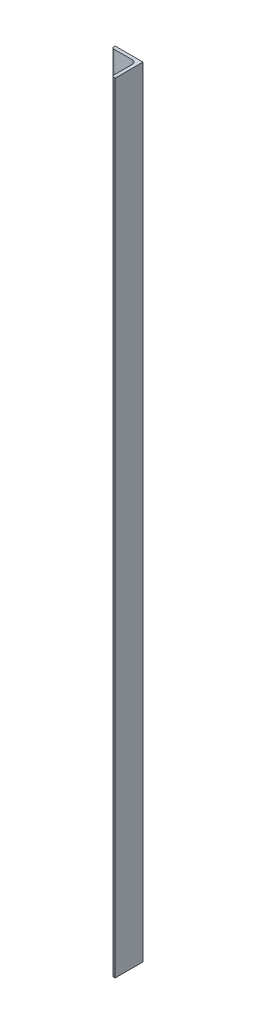
ISO-10303-21;
HEADER;
FILE_DESCRIPTION(('STEP AP214'),'2;1');
FILE_NAME('part.step','',(''),(''),'','','');
FILE_SCHEMA(('AUTOMOTIVE_DESIGN { 1 0 10303 214 1 1 1 1 }'));
ENDSEC;
DATA;
#1=APPLICATION_CONTEXT('core data for automotive mechanical design processes');
#2=APPLICATION_PROTOCOL_DEFINITION('international standard','automotive_design',2000,#1);
#3=PRODUCT_CONTEXT('',#1,'mechanical');
#4=PRODUCT('Part','Part','',(#3));
#5=PRODUCT_RELATED_PRODUCT_CATEGORY('part','',(#4));
#6=PRODUCT_DEFINITION_FORMATION('','',#4);
#7=PRODUCT_DEFINITION_CONTEXT('part definition',#1,'design');
#8=PRODUCT_DEFINITION('design','',#6,#7);
#9=PRODUCT_DEFINITION_SHAPE('','',#8);
#10=(LENGTH_UNIT() NAMED_UNIT(*) SI_UNIT(.MILLI.,.METRE.));
#11=(NAMED_UNIT(*) PLANE_ANGLE_UNIT() SI_UNIT($,.RADIAN.));
#12=(NAMED_UNIT(*) SI_UNIT($,.STERADIAN.) SOLID_ANGLE_UNIT());
#13=UNCERTAINTY_MEASURE_WITH_UNIT(LENGTH_MEASURE(1.E-05),#10,'distance_accuracy_value','');
#14=(GEOMETRIC_REPRESENTATION_CONTEXT(3) GLOBAL_UNCERTAINTY_ASSIGNED_CONTEXT((#13)) GLOBAL_UNIT_ASSIGNED_CONTEXT((#10,
#11,#12)) REPRESENTATION_CONTEXT('',''));
#15=CARTESIAN_POINT('',(0.,0.,0.));
#16=DIRECTION('',(0.,0.,1.));
#17=DIRECTION('',(1.,0.,0.));
#18=AXIS2_PLACEMENT_3D('',#15,#16,#17);
#19=CARTESIAN_POINT('',(0.,700.,0.));
#20=DIRECTION('',(-1.,0.,0.));
#21=DIRECTION('',(0.,0.,1.));
#22=AXIS2_PLACEMENT_3D('',#19,#20,#21);
#23=PLANE('',#22);
#24=DIRECTION('',(0.,0.,-1.));
#25=VECTOR('',#24,1.);
#26=CARTESIAN_POINT('',(0.,-700.,0.));
#27=LINE('',#26,#25);
#28=CARTESIAN_POINT('',(0.,-700.,50.));
#29=VERTEX_POINT('',#28);
#30=CARTESIAN_POINT('',(0.,-700.,0.));
#31=VERTEX_POINT('',#30);
#32=EDGE_CURVE('E135',#29,#31,#27,.T.);
#33=ORIENTED_EDGE('',*,*,#32,.T.);
#34=DIRECTION('',(0.,-1.,0.));
#35=VECTOR('',#34,1.);
#36=CARTESIAN_POINT('',(0.,700.,0.));
#37=LINE('',#36,#35);
#38=CARTESIAN_POINT('',(0.,700.,0.));
#39=VERTEX_POINT('',#38);
#40=EDGE_CURVE('E11',#39,#31,#37,.T.);
#41=ORIENTED_EDGE('',*,*,#40,.F.);
#42=DIRECTION('',(0.,0.,-1.));
#43=VECTOR('',#42,1.);
#44=CARTESIAN_POINT('',(0.,700.,0.));
#45=LINE('',#44,#43);
#46=CARTESIAN_POINT('',(0.,700.,50.));
#47=VERTEX_POINT('',#46);
#48=EDGE_CURVE('E152',#47,#39,#45,.T.);
#49=ORIENTED_EDGE('',*,*,#48,.F.);
#50=DIRECTION('',(0.,-1.,0.));
#51=VECTOR('',#50,1.);
#52=CARTESIAN_POINT('',(0.,700.,50.));
#53=LINE('',#52,#51);
#54=EDGE_CURVE('E131',#47,#29,#53,.T.);
#55=ORIENTED_EDGE('',*,*,#54,.T.);
#56=EDGE_LOOP('',(#33,#41,#49,#55));
#57=FACE_BOUND('',#56,.T.);
#58=ADVANCED_FACE('F33',(#57),#23,.F.);
#59=CARTESIAN_POINT('',(0.,700.,0.));
#60=DIRECTION('',(0.,0.,1.));
#61=DIRECTION('',(1.,0.,0.));
#62=AXIS2_PLACEMENT_3D('',#59,#60,#61);
#63=PLANE('',#62);
#64=CARTESIAN_POINT('',(-30.,52.92,0.));
#65=DIRECTION('',(0.,0.,-1.));
#66=DIRECTION('',(-1.,0.,0.));
#67=AXIS2_PLACEMENT_3D('',#64,#65,#66);
#68=CIRCLE('',#67,6.00000000000001);
#69=CARTESIAN_POINT('',(-36.,52.92,0.));
#70=VERTEX_POINT('',#69);
#71=EDGE_CURVE('E196',#70,#70,#68,.T.);
#72=ORIENTED_EDGE('',*,*,#71,.F.);
#73=EDGE_LOOP('',(#72));
#74=FACE_BOUND('',#73,.T.);
#75=CARTESIAN_POINT('',(-30.,-52.92,0.));
#76=DIRECTION('',(0.,0.,-1.));
#77=DIRECTION('',(1.,0.,0.));
#78=AXIS2_PLACEMENT_3D('',#75,#76,#77);
#79=CIRCLE('',#78,6.00000000000001);
#80=CARTESIAN_POINT('',(-24.,-52.92,0.));
#81=VERTEX_POINT('',#80);
#82=EDGE_CURVE('E197',#81,#81,#79,.T.);
#83=ORIENTED_EDGE('',*,*,#82,.F.);
#84=EDGE_LOOP('',(#83));
#85=FACE_BOUND('',#84,.T.);
#86=DIRECTION('',(-1.,0.,0.));
#87=VECTOR('',#86,1.);
#88=CARTESIAN_POINT('',(0.,-700.,0.));
#89=LINE('',#88,#87);
#90=CARTESIAN_POINT('',(-50.,-700.,0.));
#91=VERTEX_POINT('',#90);
#92=EDGE_CURVE('E138',#31,#91,#89,.T.);
#93=ORIENTED_EDGE('',*,*,#92,.T.);
#94=DIRECTION('',(0.,-1.,0.));
#95=VECTOR('',#94,1.);
#96=CARTESIAN_POINT('',(-50.,700.,0.));
#97=LINE('',#96,#95);
#98=CARTESIAN_POINT('',(-50.,700.,0.));
#99=VERTEX_POINT('',#98);
#100=EDGE_CURVE('E41',#99,#91,#97,.T.);
#101=ORIENTED_EDGE('',*,*,#100,.F.);
#102=DIRECTION('',(-1.,0.,0.));
#103=VECTOR('',#102,1.);
#104=CARTESIAN_POINT('',(0.,700.,0.));
#105=LINE('',#104,#103);
#106=EDGE_CURVE('E95',#39,#99,#105,.T.);
#107=ORIENTED_EDGE('',*,*,#106,.F.);
#108=ORIENTED_EDGE('',*,*,#40,.T.);
#109=EDGE_LOOP('',(#93,#101,#107,#108));
#110=FACE_BOUND('',#109,.T.);
#111=ADVANCED_FACE('F208',(#74,#85,#110),#63,.F.);
#112=CARTESIAN_POINT('',(-50.,700.,0.));
#113=DIRECTION('',(1.,0.,0.));
#114=DIRECTION('',(0.,0.,-1.));
#115=AXIS2_PLACEMENT_3D('',#112,#113,#114);
#116=PLANE('',#115);
#117=DIRECTION('',(0.,0.,1.));
#118=VECTOR('',#117,1.);
#119=CARTESIAN_POINT('',(-50.,-700.,0.));
#120=LINE('',#119,#118);
#121=CARTESIAN_POINT('',(-50.,-700.,2.50000000000001));
#122=VERTEX_POINT('',#121);
#123=EDGE_CURVE('E141',#91,#122,#120,.T.);
#124=ORIENTED_EDGE('',*,*,#123,.T.);
#125=DIRECTION('',(0.,-1.,0.));
#126=VECTOR('',#125,1.);
#127=CARTESIAN_POINT('',(-50.,700.,2.50000000000001));
#128=LINE('',#127,#126);
#129=CARTESIAN_POINT('',(-50.,700.,2.50000000000001));
#130=VERTEX_POINT('',#129);
#131=EDGE_CURVE('E162',#130,#122,#128,.T.);
#132=ORIENTED_EDGE('',*,*,#131,.F.);
#133=DIRECTION('',(0.,0.,1.));
#134=VECTOR('',#133,1.);
#135=CARTESIAN_POINT('',(-50.,700.,0.));
#136=LINE('',#135,#134);
#137=EDGE_CURVE('E170',#99,#130,#136,.T.);
#138=ORIENTED_EDGE('',*,*,#137,.F.);
#139=ORIENTED_EDGE('',*,*,#100,.T.);
#140=EDGE_LOOP('',(#124,#132,#138,#139));
#141=FACE_BOUND('',#140,.T.);
#142=ADVANCED_FACE('F168',(#141),#116,.F.);
#143=CARTESIAN_POINT('',(-46.5,700.,2.50000000000001));
#144=DIRECTION('',(0.,-1.,0.));
#145=DIRECTION('',(0.,0.,-1.));
#146=AXIS2_PLACEMENT_3D('',#143,#144,#145);
#147=CYLINDRICAL_SURFACE('',#146,3.5);
#148=CARTESIAN_POINT('',(-46.5,-700.,2.50000000000001));
#149=DIRECTION('',(0.,1.,0.));
#150=DIRECTION('',(0.,0.,1.));
#151=AXIS2_PLACEMENT_3D('',#148,#149,#150);
#152=CIRCLE('',#151,3.5);
#153=CARTESIAN_POINT('',(-46.5,-700.,6.00000000000001));
#154=VERTEX_POINT('',#153);
#155=EDGE_CURVE('E143',#122,#154,#152,.T.);
#156=ORIENTED_EDGE('',*,*,#155,.T.);
#157=DIRECTION('',(0.,-1.,0.));
#158=VECTOR('',#157,1.);
#159=CARTESIAN_POINT('',(-46.5,700.,6.00000000000001));
#160=LINE('',#159,#158);
#161=CARTESIAN_POINT('',(-46.5,700.,6.00000000000001));
#162=VERTEX_POINT('',#161);
#163=EDGE_CURVE('E159',#162,#154,#160,.T.);
#164=ORIENTED_EDGE('',*,*,#163,.F.);
#165=CARTESIAN_POINT('',(-46.5,700.,2.50000000000001));
#166=DIRECTION('',(0.,1.,0.));
#167=DIRECTION('',(0.,0.,1.));
#168=AXIS2_PLACEMENT_3D('',#165,#166,#167);
#169=CIRCLE('',#168,3.5);
#170=EDGE_CURVE('E186',#130,#162,#169,.T.);
#171=ORIENTED_EDGE('',*,*,#170,.F.);
#172=ORIENTED_EDGE('',*,*,#131,.T.);
#173=EDGE_LOOP('',(#156,#164,#171,#172));
#174=FACE_BOUND('',#173,.T.);
#175=ADVANCED_FACE('F179',(#174),#147,.T.);
#176=CARTESIAN_POINT('',(-46.5,700.,6.00000000000001));
#177=DIRECTION('',(0.,0.,-1.));
#178=DIRECTION('',(-1.,0.,0.));
#179=AXIS2_PLACEMENT_3D('',#176,#177,#178);
#180=PLANE('',#179);
#181=CARTESIAN_POINT('',(-30.,52.92,6.00000000000001));
#182=DIRECTION('',(0.,0.,-1.));
#183=DIRECTION('',(-1.,0.,0.));
#184=AXIS2_PLACEMENT_3D('',#181,#182,#183);
#185=CIRCLE('',#184,6.00000000000001);
#186=CARTESIAN_POINT('',(-36.,52.92,6.00000000000001));
#187=VERTEX_POINT('',#186);
#188=EDGE_CURVE('E139',#187,#187,#185,.F.);
#189=ORIENTED_EDGE('',*,*,#188,.F.);
#190=EDGE_LOOP('',(#189));
#191=FACE_BOUND('',#190,.T.);
#192=CARTESIAN_POINT('',(-30.,-52.92,6.00000000000001));
#193=DIRECTION('',(0.,0.,-1.));
#194=DIRECTION('',(-1.,0.,0.));
#195=AXIS2_PLACEMENT_3D('',#192,#193,#194);
#196=CIRCLE('',#195,6.00000000000001);
#197=CARTESIAN_POINT('',(-36.,-52.92,6.00000000000001));
#198=VERTEX_POINT('',#197);
#199=EDGE_CURVE('E193',#198,#198,#196,.F.);
#200=ORIENTED_EDGE('',*,*,#199,.F.);
#201=EDGE_LOOP('',(#200));
#202=FACE_BOUND('',#201,.T.);
#203=DIRECTION('',(1.,0.,0.));
#204=VECTOR('',#203,1.);
#205=CARTESIAN_POINT('',(-46.5,-700.,6.00000000000001));
#206=LINE('',#205,#204);
#207=CARTESIAN_POINT('',(-13.,-700.,6.00000000000001));
#208=VERTEX_POINT('',#207);
#209=EDGE_CURVE('E145',#154,#208,#206,.T.);
#210=ORIENTED_EDGE('',*,*,#209,.T.);
#211=DIRECTION('',(0.,-1.,0.));
#212=VECTOR('',#211,1.);
#213=CARTESIAN_POINT('',(-13.,700.,6.00000000000001));
#214=LINE('',#213,#212);
#215=CARTESIAN_POINT('',(-13.,700.,6.00000000000001));
#216=VERTEX_POINT('',#215);
#217=EDGE_CURVE('E156',#216,#208,#214,.T.);
#218=ORIENTED_EDGE('',*,*,#217,.F.);
#219=DIRECTION('',(1.,0.,0.));
#220=VECTOR('',#219,1.);
#221=CARTESIAN_POINT('',(-46.5,700.,6.00000000000001));
#222=LINE('',#221,#220);
#223=EDGE_CURVE('E185',#162,#216,#222,.T.);
#224=ORIENTED_EDGE('',*,*,#223,.F.);
#225=ORIENTED_EDGE('',*,*,#163,.T.);
#226=EDGE_LOOP('',(#210,#218,#224,#225));
#227=FACE_BOUND('',#226,.T.);
#228=ADVANCED_FACE('F183',(#191,#202,#227),#180,.F.);
#229=CARTESIAN_POINT('',(-13.,700.,13.));
#230=DIRECTION('',(0.,-1.,0.));
#231=DIRECTION('',(0.,0.,-1.));
#232=AXIS2_PLACEMENT_3D('',#229,#230,#231);
#233=CYLINDRICAL_SURFACE('',#232,7.);
#234=CARTESIAN_POINT('',(-13.,-700.,13.));
#235=DIRECTION('',(0.,-1.,0.));
#236=DIRECTION('',(0.,0.,-1.));
#237=AXIS2_PLACEMENT_3D('',#234,#235,#236);
#238=CIRCLE('',#237,7.);
#239=CARTESIAN_POINT('',(-6.,-700.,13.));
#240=VERTEX_POINT('',#239);
#241=EDGE_CURVE('E147',#208,#240,#238,.T.);
#242=ORIENTED_EDGE('',*,*,#241,.T.);
#243=DIRECTION('',(0.,-1.,0.));
#244=VECTOR('',#243,1.);
#245=CARTESIAN_POINT('',(-6.,700.,13.));
#246=LINE('',#245,#244);
#247=CARTESIAN_POINT('',(-6.,700.,13.));
#248=VERTEX_POINT('',#247);
#249=EDGE_CURVE('E126',#248,#240,#246,.T.);
#250=ORIENTED_EDGE('',*,*,#249,.F.);
#251=CARTESIAN_POINT('',(-13.,700.,13.));
#252=DIRECTION('',(0.,-1.,0.));
#253=DIRECTION('',(0.,0.,-1.));
#254=AXIS2_PLACEMENT_3D('',#251,#252,#253);
#255=CIRCLE('',#254,7.);
#256=EDGE_CURVE('E117',#216,#248,#255,.T.);
#257=ORIENTED_EDGE('',*,*,#256,.F.);
#258=ORIENTED_EDGE('',*,*,#217,.T.);
#259=EDGE_LOOP('',(#242,#250,#257,#258));
#260=FACE_BOUND('',#259,.T.);
#261=ADVANCED_FACE('F216',(#260),#233,.F.);
#262=CARTESIAN_POINT('',(-6.,700.,46.5));
#263=DIRECTION('',(1.,0.,0.));
#264=DIRECTION('',(0.,0.,-1.));
#265=AXIS2_PLACEMENT_3D('',#262,#263,#264);
#266=PLANE('',#265);
#267=DIRECTION('',(0.,0.,1.));
#268=VECTOR('',#267,1.);
#269=CARTESIAN_POINT('',(-6.,-700.,46.5));
#270=LINE('',#269,#268);
#271=CARTESIAN_POINT('',(-6.,-700.,46.5));
#272=VERTEX_POINT('',#271);
#273=EDGE_CURVE('E125',#240,#272,#270,.T.);
#274=ORIENTED_EDGE('',*,*,#273,.T.);
#275=DIRECTION('',(0.,-1.,0.));
#276=VECTOR('',#275,1.);
#277=CARTESIAN_POINT('',(-6.,700.,46.5));
#278=LINE('',#277,#276);
#279=CARTESIAN_POINT('',(-6.,700.,46.5));
#280=VERTEX_POINT('',#279);
#281=EDGE_CURVE('E122',#280,#272,#278,.T.);
#282=ORIENTED_EDGE('',*,*,#281,.F.);
#283=DIRECTION('',(0.,0.,1.));
#284=VECTOR('',#283,1.);
#285=CARTESIAN_POINT('',(-6.,700.,46.5));
#286=LINE('',#285,#284);
#287=EDGE_CURVE('E111',#248,#280,#286,.T.);
#288=ORIENTED_EDGE('',*,*,#287,.F.);
#289=ORIENTED_EDGE('',*,*,#249,.T.);
#290=EDGE_LOOP('',(#274,#282,#288,#289));
#291=FACE_BOUND('',#290,.T.);
#292=ADVANCED_FACE('F123',(#291),#266,.F.);
#293=CARTESIAN_POINT('',(-2.49999999999999,700.,46.5));
#294=DIRECTION('',(0.,-1.,0.));
#295=DIRECTION('',(0.,0.,-1.));
#296=AXIS2_PLACEMENT_3D('',#293,#294,#295);
#297=CYLINDRICAL_SURFACE('',#296,3.5);
#298=CARTESIAN_POINT('',(-2.49999999999999,-700.,46.5));
#299=DIRECTION('',(0.,1.,0.));
#300=DIRECTION('',(0.,0.,-1.));
#301=AXIS2_PLACEMENT_3D('',#298,#299,#300);
#302=CIRCLE('',#301,3.5);
#303=CARTESIAN_POINT('',(-2.49999999999999,-700.,50.));
#304=VERTEX_POINT('',#303);
#305=EDGE_CURVE('E81',#272,#304,#302,.T.);
#306=ORIENTED_EDGE('',*,*,#305,.T.);
#307=DIRECTION('',(0.,-1.,0.));
#308=VECTOR('',#307,1.);
#309=CARTESIAN_POINT('',(-2.49999999999999,700.,50.));
#310=LINE('',#309,#308);
#311=CARTESIAN_POINT('',(-2.49999999999999,700.,50.));
#312=VERTEX_POINT('',#311);
#313=EDGE_CURVE('E127',#312,#304,#310,.T.);
#314=ORIENTED_EDGE('',*,*,#313,.F.);
#315=CARTESIAN_POINT('',(-2.49999999999999,700.,46.5));
#316=DIRECTION('',(0.,1.,0.));
#317=DIRECTION('',(0.,0.,-1.));
#318=AXIS2_PLACEMENT_3D('',#315,#316,#317);
#319=CIRCLE('',#318,3.5);
#320=EDGE_CURVE('E115',#280,#312,#319,.T.);
#321=ORIENTED_EDGE('',*,*,#320,.F.);
#322=ORIENTED_EDGE('',*,*,#281,.T.);
#323=EDGE_LOOP('',(#306,#314,#321,#322));
#324=FACE_BOUND('',#323,.T.);
#325=ADVANCED_FACE('F129',(#324),#297,.T.);
#326=CARTESIAN_POINT('',(0.,700.,50.));
#327=DIRECTION('',(0.,0.,-1.));
#328=DIRECTION('',(-1.,0.,0.));
#329=AXIS2_PLACEMENT_3D('',#326,#327,#328);
#330=PLANE('',#329);
#331=DIRECTION('',(1.,0.,0.));
#332=VECTOR('',#331,1.);
#333=CARTESIAN_POINT('',(0.,-700.,50.));
#334=LINE('',#333,#332);
#335=EDGE_CURVE('E87',#304,#29,#334,.T.);
#336=ORIENTED_EDGE('',*,*,#335,.T.);
#337=ORIENTED_EDGE('',*,*,#54,.F.);
#338=DIRECTION('',(1.,0.,0.));
#339=VECTOR('',#338,1.);
#340=CARTESIAN_POINT('',(0.,700.,50.));
#341=LINE('',#340,#339);
#342=EDGE_CURVE('E49',#312,#47,#341,.T.);
#343=ORIENTED_EDGE('',*,*,#342,.F.);
#344=ORIENTED_EDGE('',*,*,#313,.T.);
#345=EDGE_LOOP('',(#336,#337,#343,#344));
#346=FACE_BOUND('',#345,.T.);
#347=ADVANCED_FACE('F278',(#346),#330,.F.);
#348=CARTESIAN_POINT('',(-2.49999999999999,700.,46.5));
#349=DIRECTION('',(0.,-1.,0.));
#350=DIRECTION('',(0.,0.,-1.));
#351=AXIS2_PLACEMENT_3D('',#348,#349,#350);
#352=PLANE('',#351);
#353=ORIENTED_EDGE('',*,*,#48,.T.);
#354=ORIENTED_EDGE('',*,*,#106,.T.);
#355=ORIENTED_EDGE('',*,*,#137,.T.);
#356=ORIENTED_EDGE('',*,*,#170,.T.);
#357=ORIENTED_EDGE('',*,*,#223,.T.);
#358=ORIENTED_EDGE('',*,*,#256,.T.);
#359=ORIENTED_EDGE('',*,*,#287,.T.);
#360=ORIENTED_EDGE('',*,*,#320,.T.);
#361=ORIENTED_EDGE('',*,*,#342,.T.);
#362=EDGE_LOOP('',(#353,#354,#355,#356,#357,#358,#359,#360,#361));
#363=FACE_BOUND('',#362,.T.);
#364=ADVANCED_FACE('F113',(#363),#352,.F.);
#365=CARTESIAN_POINT('',(-2.49999999999999,-700.,46.5));
#366=DIRECTION('',(0.,-1.,0.));
#367=DIRECTION('',(0.,0.,-1.));
#368=AXIS2_PLACEMENT_3D('',#365,#366,#367);
#369=PLANE('',#368);
#370=ORIENTED_EDGE('',*,*,#32,.F.);
#371=ORIENTED_EDGE('',*,*,#335,.F.);
#372=ORIENTED_EDGE('',*,*,#305,.F.);
#373=ORIENTED_EDGE('',*,*,#273,.F.);
#374=ORIENTED_EDGE('',*,*,#241,.F.);
#375=ORIENTED_EDGE('',*,*,#209,.F.);
#376=ORIENTED_EDGE('',*,*,#155,.F.);
#377=ORIENTED_EDGE('',*,*,#123,.F.);
#378=ORIENTED_EDGE('',*,*,#92,.F.);
#379=EDGE_LOOP('',(#370,#371,#372,#373,#374,#375,#376,#377,#378));
#380=FACE_BOUND('',#379,.T.);
#381=ADVANCED_FACE('F174',(#380),#369,.T.);
#382=CARTESIAN_POINT('',(-30.,-52.92,50.001));
#383=DIRECTION('',(0.,0.,-1.));
#384=DIRECTION('',(-1.,0.,0.));
#385=AXIS2_PLACEMENT_3D('',#382,#383,#384);
#386=CYLINDRICAL_SURFACE('',#385,6.00000000000001);
#387=ORIENTED_EDGE('',*,*,#82,.T.);
#388=EDGE_LOOP('',(#387));
#389=FACE_BOUND('',#388,.T.);
#390=ORIENTED_EDGE('',*,*,#199,.T.);
#391=EDGE_LOOP('',(#390));
#392=FACE_BOUND('',#391,.T.);
#393=ADVANCED_FACE('F256',(#389,#392),#386,.F.);
#394=CARTESIAN_POINT('',(-30.,52.92,50.001));
#395=DIRECTION('',(0.,0.,-1.));
#396=DIRECTION('',(-1.,0.,0.));
#397=AXIS2_PLACEMENT_3D('',#394,#395,#396);
#398=CYLINDRICAL_SURFACE('',#397,6.00000000000001);
#399=ORIENTED_EDGE('',*,*,#71,.T.);
#400=EDGE_LOOP('',(#399));
#401=FACE_BOUND('',#400,.T.);
#402=ORIENTED_EDGE('',*,*,#188,.T.);
#403=EDGE_LOOP('',(#402));
#404=FACE_BOUND('',#403,.T.);
#405=ADVANCED_FACE('F205',(#401,#404),#398,.F.);
#406=CLOSED_SHELL('',(#58,#111,#142,#175,#228,#261,#292,#325,#347,#364,#381,#393,#405));
#407=MANIFOLD_SOLID_BREP('B2',#406);
#408=ADVANCED_BREP_SHAPE_REPRESENTATION('',(#18,#407),#14);
#409=SHAPE_DEFINITION_REPRESENTATION(#9,#408);
ENDSEC;
END-ISO-10303-21;
